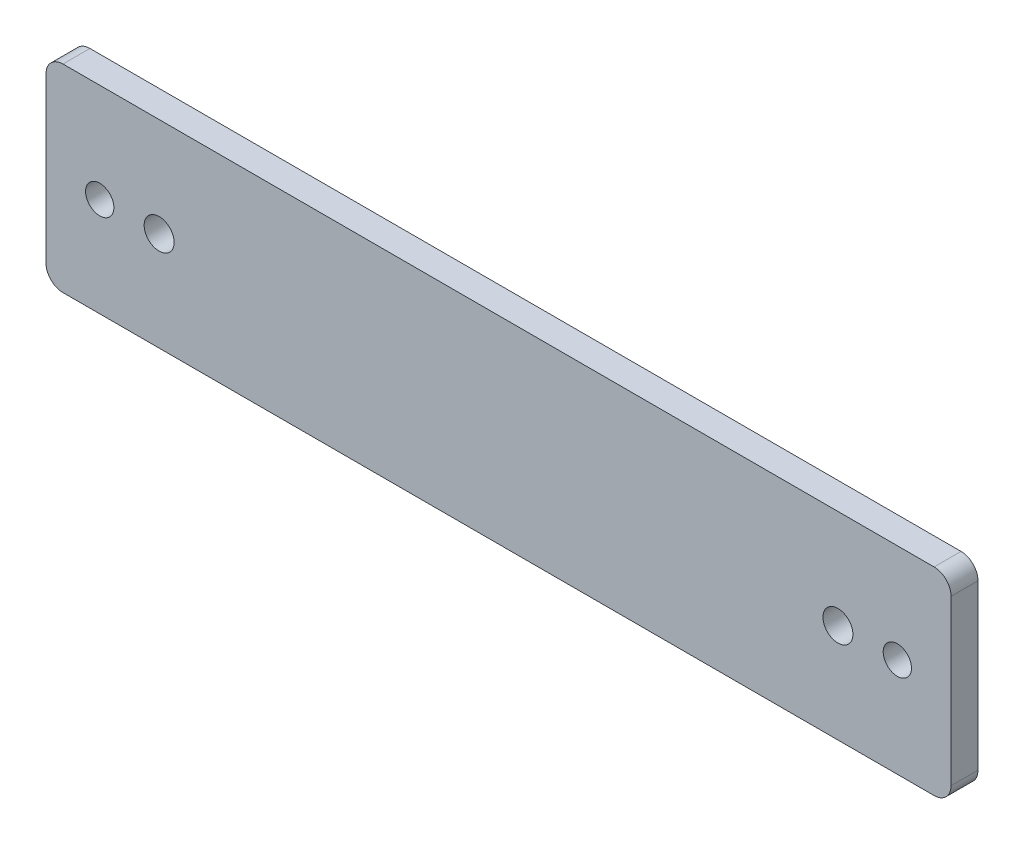
ISO-10303-21;
HEADER;
FILE_DESCRIPTION(('STEP AP214'),'2;1');
FILE_NAME('part.step','',(''),(''),'','','');
FILE_SCHEMA(('AUTOMOTIVE_DESIGN { 1 0 10303 214 1 1 1 1 }'));
ENDSEC;
DATA;
#1=APPLICATION_CONTEXT('core data for automotive mechanical design processes');
#2=APPLICATION_PROTOCOL_DEFINITION('international standard','automotive_design',2000,#1);
#3=PRODUCT_CONTEXT('',#1,'mechanical');
#4=PRODUCT('Part','Part','',(#3));
#5=PRODUCT_RELATED_PRODUCT_CATEGORY('part','',(#4));
#6=PRODUCT_DEFINITION_FORMATION('','',#4);
#7=PRODUCT_DEFINITION_CONTEXT('part definition',#1,'design');
#8=PRODUCT_DEFINITION('design','',#6,#7);
#9=PRODUCT_DEFINITION_SHAPE('','',#8);
#10=(LENGTH_UNIT() NAMED_UNIT(*) SI_UNIT(.MILLI.,.METRE.));
#11=(NAMED_UNIT(*) PLANE_ANGLE_UNIT() SI_UNIT($,.RADIAN.));
#12=(NAMED_UNIT(*) SI_UNIT($,.STERADIAN.) SOLID_ANGLE_UNIT());
#13=UNCERTAINTY_MEASURE_WITH_UNIT(LENGTH_MEASURE(1.E-05),#10,'distance_accuracy_value','');
#14=(GEOMETRIC_REPRESENTATION_CONTEXT(3) GLOBAL_UNCERTAINTY_ASSIGNED_CONTEXT((#13)) GLOBAL_UNIT_ASSIGNED_CONTEXT((#10,
#11,#12)) REPRESENTATION_CONTEXT('',''));
#15=CARTESIAN_POINT('',(0.,0.,0.));
#16=DIRECTION('',(0.,0.,1.));
#17=DIRECTION('',(1.,0.,0.));
#18=AXIS2_PLACEMENT_3D('',#15,#16,#17);
#19=CARTESIAN_POINT('',(0.,0.,4.7625));
#20=DIRECTION('',(0.,0.,-1.));
#21=DIRECTION('',(-1.,0.,0.));
#22=AXIS2_PLACEMENT_3D('',#19,#20,#21);
#23=PLANE('',#22);
#24=CARTESIAN_POINT('',(-60.,0.,4.7625));
#25=DIRECTION('',(0.,0.,1.));
#26=DIRECTION('',(1.,0.,0.));
#27=AXIS2_PLACEMENT_3D('',#24,#25,#26);
#28=CIRCLE('',#27,2.65);
#29=CARTESIAN_POINT('',(-57.35,0.,4.7625));
#30=VERTEX_POINT('',#29);
#31=EDGE_CURVE('E203',#30,#30,#28,.T.);
#32=ORIENTED_EDGE('',*,*,#31,.F.);
#33=EDGE_LOOP('',(#32));
#34=FACE_BOUND('',#33,.T.);
#35=CARTESIAN_POINT('',(60.,0.,4.7625));
#36=DIRECTION('',(0.,0.,1.));
#37=DIRECTION('',(1.,0.,0.));
#38=AXIS2_PLACEMENT_3D('',#35,#36,#37);
#39=CIRCLE('',#38,2.65);
#40=CARTESIAN_POINT('',(62.65,0.,4.7625));
#41=VERTEX_POINT('',#40);
#42=EDGE_CURVE('E197',#41,#41,#39,.T.);
#43=ORIENTED_EDGE('',*,*,#42,.F.);
#44=EDGE_LOOP('',(#43));
#45=FACE_BOUND('',#44,.T.);
#46=DIRECTION('',(1.,0.,0.));
#47=VECTOR('',#46,1.);
#48=CARTESIAN_POINT('',(-80.,-17.5,4.7625));
#49=LINE('',#48,#47);
#50=CARTESIAN_POINT('',(-77.,-17.5,4.7625));
#51=VERTEX_POINT('',#50);
#52=CARTESIAN_POINT('',(77.,-17.5,4.7625));
#53=VERTEX_POINT('',#52);
#54=EDGE_CURVE('E143',#51,#53,#49,.T.);
#55=ORIENTED_EDGE('',*,*,#54,.T.);
#56=CARTESIAN_POINT('',(77.,-14.5,4.7625));
#57=DIRECTION('',(0.,0.,-1.));
#58=DIRECTION('',(-1.,0.,0.));
#59=AXIS2_PLACEMENT_3D('',#56,#57,#58);
#60=CIRCLE('',#59,3.);
#61=CARTESIAN_POINT('',(80.,-14.5,4.7625));
#62=VERTEX_POINT('',#61);
#63=EDGE_CURVE('E161',#53,#62,#60,.F.);
#64=ORIENTED_EDGE('',*,*,#63,.T.);
#65=DIRECTION('',(0.,1.,0.));
#66=VECTOR('',#65,1.);
#67=CARTESIAN_POINT('',(80.,-17.5,4.7625));
#68=LINE('',#67,#66);
#69=CARTESIAN_POINT('',(80.,14.5,4.7625));
#70=VERTEX_POINT('',#69);
#71=EDGE_CURVE('E125',#62,#70,#68,.T.);
#72=ORIENTED_EDGE('',*,*,#71,.T.);
#73=CARTESIAN_POINT('',(77.,14.5,4.7625));
#74=DIRECTION('',(0.,0.,-1.));
#75=DIRECTION('',(-1.,0.,0.));
#76=AXIS2_PLACEMENT_3D('',#73,#74,#75);
#77=CIRCLE('',#76,3.);
#78=CARTESIAN_POINT('',(77.,17.5,4.7625));
#79=VERTEX_POINT('',#78);
#80=EDGE_CURVE('E158',#70,#79,#77,.F.);
#81=ORIENTED_EDGE('',*,*,#80,.T.);
#82=DIRECTION('',(-1.,0.,0.));
#83=VECTOR('',#82,1.);
#84=CARTESIAN_POINT('',(-80.,17.5,4.7625));
#85=LINE('',#84,#83);
#86=CARTESIAN_POINT('',(-77.,17.5,4.7625));
#87=VERTEX_POINT('',#86);
#88=EDGE_CURVE('E172',#79,#87,#85,.T.);
#89=ORIENTED_EDGE('',*,*,#88,.T.);
#90=CARTESIAN_POINT('',(-77.,14.5,4.7625));
#91=DIRECTION('',(0.,0.,-1.));
#92=DIRECTION('',(-1.,0.,0.));
#93=AXIS2_PLACEMENT_3D('',#90,#91,#92);
#94=CIRCLE('',#93,3.);
#95=CARTESIAN_POINT('',(-80.,14.5,4.7625));
#96=VERTEX_POINT('',#95);
#97=EDGE_CURVE('E61',#87,#96,#94,.F.);
#98=ORIENTED_EDGE('',*,*,#97,.T.);
#99=DIRECTION('',(0.,-1.,0.));
#100=VECTOR('',#99,1.);
#101=CARTESIAN_POINT('',(-80.,-17.5,4.7625));
#102=LINE('',#101,#100);
#103=CARTESIAN_POINT('',(-80.,-14.5,4.7625));
#104=VERTEX_POINT('',#103);
#105=EDGE_CURVE('E180',#96,#104,#102,.T.);
#106=ORIENTED_EDGE('',*,*,#105,.T.);
#107=CARTESIAN_POINT('',(-77.,-14.5,4.7625));
#108=DIRECTION('',(0.,0.,-1.));
#109=DIRECTION('',(-1.,0.,0.));
#110=AXIS2_PLACEMENT_3D('',#107,#108,#109);
#111=CIRCLE('',#110,3.);
#112=EDGE_CURVE('E156',#104,#51,#111,.F.);
#113=ORIENTED_EDGE('',*,*,#112,.T.);
#114=EDGE_LOOP('',(#55,#64,#72,#81,#89,#98,#106,#113));
#115=FACE_BOUND('',#114,.T.);
#116=CARTESIAN_POINT('',(-70.5,0.,4.7625));
#117=DIRECTION('',(0.,0.,1.));
#118=DIRECTION('',(1.,0.,0.));
#119=AXIS2_PLACEMENT_3D('',#116,#117,#118);
#120=CIRCLE('',#119,2.50000000000001);
#121=CARTESIAN_POINT('',(-73.,0.,4.7625));
#122=VERTEX_POINT('',#121);
#123=EDGE_CURVE('E134',#122,#122,#120,.T.);
#124=ORIENTED_EDGE('',*,*,#123,.F.);
#125=EDGE_LOOP('',(#124));
#126=FACE_BOUND('',#125,.T.);
#127=CARTESIAN_POINT('',(70.5,0.,4.7625));
#128=DIRECTION('',(0.,0.,1.));
#129=DIRECTION('',(1.,0.,0.));
#130=AXIS2_PLACEMENT_3D('',#127,#128,#129);
#131=CIRCLE('',#130,2.50000000000001);
#132=CARTESIAN_POINT('',(68.,0.,4.7625));
#133=VERTEX_POINT('',#132);
#134=EDGE_CURVE('E187',#133,#133,#131,.T.);
#135=ORIENTED_EDGE('',*,*,#134,.F.);
#136=EDGE_LOOP('',(#135));
#137=FACE_BOUND('',#136,.T.);
#138=ADVANCED_FACE('F39',(#34,#45,#115,#126,#137),#23,.F.);
#139=CARTESIAN_POINT('',(0.,0.,0.));
#140=DIRECTION('',(0.,0.,-1.));
#141=DIRECTION('',(-1.,0.,0.));
#142=AXIS2_PLACEMENT_3D('',#139,#140,#141);
#143=PLANE('',#142);
#144=CARTESIAN_POINT('',(-60.,0.,0.));
#145=DIRECTION('',(0.,0.,1.));
#146=DIRECTION('',(1.,0.,0.));
#147=AXIS2_PLACEMENT_3D('',#144,#145,#146);
#148=CIRCLE('',#147,2.65);
#149=CARTESIAN_POINT('',(-57.35,0.,0.));
#150=VERTEX_POINT('',#149);
#151=EDGE_CURVE('E200',#150,#150,#148,.T.);
#152=ORIENTED_EDGE('',*,*,#151,.T.);
#153=EDGE_LOOP('',(#152));
#154=FACE_BOUND('',#153,.T.);
#155=CARTESIAN_POINT('',(60.,0.,0.));
#156=DIRECTION('',(0.,0.,1.));
#157=DIRECTION('',(1.,0.,0.));
#158=AXIS2_PLACEMENT_3D('',#155,#156,#157);
#159=CIRCLE('',#158,2.65);
#160=CARTESIAN_POINT('',(62.65,0.,0.));
#161=VERTEX_POINT('',#160);
#162=EDGE_CURVE('E192',#161,#161,#159,.T.);
#163=ORIENTED_EDGE('',*,*,#162,.T.);
#164=EDGE_LOOP('',(#163));
#165=FACE_BOUND('',#164,.T.);
#166=CARTESIAN_POINT('',(-70.5,0.,0.));
#167=DIRECTION('',(0.,0.,1.));
#168=DIRECTION('',(1.,0.,0.));
#169=AXIS2_PLACEMENT_3D('',#166,#167,#168);
#170=CIRCLE('',#169,2.50000000000001);
#171=CARTESIAN_POINT('',(-73.,0.,0.));
#172=VERTEX_POINT('',#171);
#173=EDGE_CURVE('E140',#172,#172,#170,.T.);
#174=ORIENTED_EDGE('',*,*,#173,.T.);
#175=EDGE_LOOP('',(#174));
#176=FACE_BOUND('',#175,.T.);
#177=DIRECTION('',(0.,1.,0.));
#178=VECTOR('',#177,1.);
#179=CARTESIAN_POINT('',(80.,-17.5,0.));
#180=LINE('',#179,#178);
#181=CARTESIAN_POINT('',(80.,-14.5,0.));
#182=VERTEX_POINT('',#181);
#183=CARTESIAN_POINT('',(80.,14.5,0.));
#184=VERTEX_POINT('',#183);
#185=EDGE_CURVE('E122',#182,#184,#180,.T.);
#186=ORIENTED_EDGE('',*,*,#185,.F.);
#187=CARTESIAN_POINT('',(77.,-14.5,0.));
#188=DIRECTION('',(0.,0.,-1.));
#189=DIRECTION('',(-1.,0.,0.));
#190=AXIS2_PLACEMENT_3D('',#187,#188,#189);
#191=CIRCLE('',#190,3.);
#192=CARTESIAN_POINT('',(77.,-17.5,0.));
#193=VERTEX_POINT('',#192);
#194=EDGE_CURVE('E105',#182,#193,#191,.T.);
#195=ORIENTED_EDGE('',*,*,#194,.T.);
#196=DIRECTION('',(1.,0.,0.));
#197=VECTOR('',#196,1.);
#198=CARTESIAN_POINT('',(-80.,-17.5,0.));
#199=LINE('',#198,#197);
#200=CARTESIAN_POINT('',(-77.,-17.5,0.));
#201=VERTEX_POINT('',#200);
#202=EDGE_CURVE('E147',#201,#193,#199,.T.);
#203=ORIENTED_EDGE('',*,*,#202,.F.);
#204=CARTESIAN_POINT('',(-77.,-14.5,0.));
#205=DIRECTION('',(0.,0.,-1.));
#206=DIRECTION('',(-1.,0.,0.));
#207=AXIS2_PLACEMENT_3D('',#204,#205,#206);
#208=CIRCLE('',#207,3.);
#209=CARTESIAN_POINT('',(-80.,-14.5,0.));
#210=VERTEX_POINT('',#209);
#211=EDGE_CURVE('E126',#201,#210,#208,.T.);
#212=ORIENTED_EDGE('',*,*,#211,.T.);
#213=DIRECTION('',(0.,-1.,0.));
#214=VECTOR('',#213,1.);
#215=CARTESIAN_POINT('',(-80.,-17.5,0.));
#216=LINE('',#215,#214);
#217=CARTESIAN_POINT('',(-80.,14.5,0.));
#218=VERTEX_POINT('',#217);
#219=EDGE_CURVE('E137',#218,#210,#216,.T.);
#220=ORIENTED_EDGE('',*,*,#219,.F.);
#221=CARTESIAN_POINT('',(-77.,14.5,0.));
#222=DIRECTION('',(0.,0.,-1.));
#223=DIRECTION('',(-1.,0.,0.));
#224=AXIS2_PLACEMENT_3D('',#221,#222,#223);
#225=CIRCLE('',#224,3.);
#226=CARTESIAN_POINT('',(-77.,17.5,0.));
#227=VERTEX_POINT('',#226);
#228=EDGE_CURVE('E116',#218,#227,#225,.T.);
#229=ORIENTED_EDGE('',*,*,#228,.T.);
#230=DIRECTION('',(-1.,0.,0.));
#231=VECTOR('',#230,1.);
#232=CARTESIAN_POINT('',(-80.,17.5,0.));
#233=LINE('',#232,#231);
#234=CARTESIAN_POINT('',(77.,17.5,0.));
#235=VERTEX_POINT('',#234);
#236=EDGE_CURVE('E133',#235,#227,#233,.T.);
#237=ORIENTED_EDGE('',*,*,#236,.F.);
#238=CARTESIAN_POINT('',(77.,14.5,0.));
#239=DIRECTION('',(0.,0.,-1.));
#240=DIRECTION('',(-1.,0.,0.));
#241=AXIS2_PLACEMENT_3D('',#238,#239,#240);
#242=CIRCLE('',#241,3.);
#243=EDGE_CURVE('E132',#235,#184,#242,.T.);
#244=ORIENTED_EDGE('',*,*,#243,.T.);
#245=EDGE_LOOP('',(#186,#195,#203,#212,#220,#229,#237,#244));
#246=FACE_BOUND('',#245,.T.);
#247=CARTESIAN_POINT('',(70.5,0.,0.));
#248=DIRECTION('',(0.,0.,1.));
#249=DIRECTION('',(1.,0.,0.));
#250=AXIS2_PLACEMENT_3D('',#247,#248,#249);
#251=CIRCLE('',#250,2.50000000000001);
#252=CARTESIAN_POINT('',(68.,0.,0.));
#253=VERTEX_POINT('',#252);
#254=EDGE_CURVE('E189',#253,#253,#251,.T.);
#255=ORIENTED_EDGE('',*,*,#254,.T.);
#256=EDGE_LOOP('',(#255));
#257=FACE_BOUND('',#256,.T.);
#258=ADVANCED_FACE('F129',(#154,#165,#176,#246,#257),#143,.T.);
#259=CARTESIAN_POINT('',(80.,-17.5,4.7625));
#260=DIRECTION('',(-1.,0.,0.));
#261=DIRECTION('',(0.,0.,1.));
#262=AXIS2_PLACEMENT_3D('',#259,#260,#261);
#263=PLANE('',#262);
#264=ORIENTED_EDGE('',*,*,#71,.F.);
#265=DIRECTION('',(0.,0.,-1.));
#266=VECTOR('',#265,1.);
#267=CARTESIAN_POINT('',(80.,-14.5,4.7625));
#268=LINE('',#267,#266);
#269=EDGE_CURVE('E109',#62,#182,#268,.T.);
#270=ORIENTED_EDGE('',*,*,#269,.T.);
#271=ORIENTED_EDGE('',*,*,#185,.T.);
#272=DIRECTION('',(0.,0.,-1.));
#273=VECTOR('',#272,1.);
#274=CARTESIAN_POINT('',(80.,14.5,4.7625));
#275=LINE('',#274,#273);
#276=EDGE_CURVE('E127',#184,#70,#275,.F.);
#277=ORIENTED_EDGE('',*,*,#276,.T.);
#278=EDGE_LOOP('',(#264,#270,#271,#277));
#279=FACE_BOUND('',#278,.T.);
#280=ADVANCED_FACE('F121',(#279),#263,.F.);
#281=CARTESIAN_POINT('',(-80.,17.5,4.7625));
#282=DIRECTION('',(0.,-1.,0.));
#283=DIRECTION('',(0.,0.,-1.));
#284=AXIS2_PLACEMENT_3D('',#281,#282,#283);
#285=PLANE('',#284);
#286=ORIENTED_EDGE('',*,*,#236,.T.);
#287=DIRECTION('',(0.,0.,-1.));
#288=VECTOR('',#287,1.);
#289=CARTESIAN_POINT('',(-77.,17.5,4.7625));
#290=LINE('',#289,#288);
#291=EDGE_CURVE('E11',#227,#87,#290,.F.);
#292=ORIENTED_EDGE('',*,*,#291,.T.);
#293=ORIENTED_EDGE('',*,*,#88,.F.);
#294=DIRECTION('',(0.,0.,-1.));
#295=VECTOR('',#294,1.);
#296=CARTESIAN_POINT('',(77.,17.5,4.7625));
#297=LINE('',#296,#295);
#298=EDGE_CURVE('E47',#79,#235,#297,.T.);
#299=ORIENTED_EDGE('',*,*,#298,.T.);
#300=EDGE_LOOP('',(#286,#292,#293,#299));
#301=FACE_BOUND('',#300,.T.);
#302=ADVANCED_FACE('F170',(#301),#285,.F.);
#303=CARTESIAN_POINT('',(-80.,-17.5,4.7625));
#304=DIRECTION('',(1.,0.,0.));
#305=DIRECTION('',(0.,0.,-1.));
#306=AXIS2_PLACEMENT_3D('',#303,#304,#305);
#307=PLANE('',#306);
#308=ORIENTED_EDGE('',*,*,#105,.F.);
#309=DIRECTION('',(0.,0.,-1.));
#310=VECTOR('',#309,1.);
#311=CARTESIAN_POINT('',(-80.,14.5,4.7625));
#312=LINE('',#311,#310);
#313=EDGE_CURVE('E164',#96,#218,#312,.T.);
#314=ORIENTED_EDGE('',*,*,#313,.T.);
#315=ORIENTED_EDGE('',*,*,#219,.T.);
#316=DIRECTION('',(0.,0.,-1.));
#317=VECTOR('',#316,1.);
#318=CARTESIAN_POINT('',(-80.,-14.5,4.7625));
#319=LINE('',#318,#317);
#320=EDGE_CURVE('E54',#210,#104,#319,.F.);
#321=ORIENTED_EDGE('',*,*,#320,.T.);
#322=EDGE_LOOP('',(#308,#314,#315,#321));
#323=FACE_BOUND('',#322,.T.);
#324=ADVANCED_FACE('F179',(#323),#307,.F.);
#325=CARTESIAN_POINT('',(-80.,-17.5,4.7625));
#326=DIRECTION('',(0.,1.,0.));
#327=DIRECTION('',(0.,0.,1.));
#328=AXIS2_PLACEMENT_3D('',#325,#326,#327);
#329=PLANE('',#328);
#330=ORIENTED_EDGE('',*,*,#202,.T.);
#331=DIRECTION('',(0.,0.,-1.));
#332=VECTOR('',#331,1.);
#333=CARTESIAN_POINT('',(77.,-17.5,4.7625));
#334=LINE('',#333,#332);
#335=EDGE_CURVE('E110',#193,#53,#334,.F.);
#336=ORIENTED_EDGE('',*,*,#335,.T.);
#337=ORIENTED_EDGE('',*,*,#54,.F.);
#338=DIRECTION('',(0.,0.,-1.));
#339=VECTOR('',#338,1.);
#340=CARTESIAN_POINT('',(-77.,-17.5,4.7625));
#341=LINE('',#340,#339);
#342=EDGE_CURVE('E115',#51,#201,#341,.T.);
#343=ORIENTED_EDGE('',*,*,#342,.T.);
#344=EDGE_LOOP('',(#330,#336,#337,#343));
#345=FACE_BOUND('',#344,.T.);
#346=ADVANCED_FACE('F236',(#345),#329,.F.);
#347=CARTESIAN_POINT('',(-70.5,0.,4.7625));
#348=DIRECTION('',(0.,0.,-1.));
#349=DIRECTION('',(-1.,0.,0.));
#350=AXIS2_PLACEMENT_3D('',#347,#348,#349);
#351=CYLINDRICAL_SURFACE('',#350,2.50000000000001);
#352=CARTESIAN_POINT('',(-73.,0.,4.7625));
#353=CARTESIAN_POINT('',(-73.,0.,4.712890625));
#354=CARTESIAN_POINT('',(-73.,0.,4.66328125));
#355=CARTESIAN_POINT('',(-73.,0.,4.5640625));
#356=CARTESIAN_POINT('',(-73.,0.,4.514453125));
#357=CARTESIAN_POINT('',(-73.,0.,4.415234375));
#358=CARTESIAN_POINT('',(-73.,0.,4.365625));
#359=CARTESIAN_POINT('',(-73.,0.,4.26640625));
#360=CARTESIAN_POINT('',(-73.,0.,4.216796875));
#361=CARTESIAN_POINT('',(-73.,0.,4.117578125));
#362=CARTESIAN_POINT('',(-73.,0.,4.06796875));
#363=CARTESIAN_POINT('',(-73.,0.,3.96875));
#364=CARTESIAN_POINT('',(-73.,0.,3.919140625));
#365=CARTESIAN_POINT('',(-73.,0.,3.819921875));
#366=CARTESIAN_POINT('',(-73.,0.,3.7703125));
#367=CARTESIAN_POINT('',(-73.,0.,3.67109375));
#368=CARTESIAN_POINT('',(-73.,0.,3.621484375));
#369=CARTESIAN_POINT('',(-73.,0.,3.522265625));
#370=CARTESIAN_POINT('',(-73.,0.,3.47265625));
#371=CARTESIAN_POINT('',(-73.,0.,3.3734375));
#372=CARTESIAN_POINT('',(-73.,0.,3.323828125));
#373=CARTESIAN_POINT('',(-73.,0.,3.224609375));
#374=CARTESIAN_POINT('',(-73.,0.,3.175));
#375=CARTESIAN_POINT('',(-73.,0.,3.07578125));
#376=CARTESIAN_POINT('',(-73.,0.,3.026171875));
#377=CARTESIAN_POINT('',(-73.,0.,2.926953125));
#378=CARTESIAN_POINT('',(-73.,0.,2.87734375));
#379=CARTESIAN_POINT('',(-73.,0.,2.778125));
#380=CARTESIAN_POINT('',(-73.,0.,2.728515625));
#381=CARTESIAN_POINT('',(-73.,0.,2.629296875));
#382=CARTESIAN_POINT('',(-73.,0.,2.5796875));
#383=CARTESIAN_POINT('',(-73.,0.,2.48046875));
#384=CARTESIAN_POINT('',(-73.,0.,2.430859375));
#385=CARTESIAN_POINT('',(-73.,0.,2.331640625));
#386=CARTESIAN_POINT('',(-73.,0.,2.28203125));
#387=CARTESIAN_POINT('',(-73.,0.,2.1828125));
#388=CARTESIAN_POINT('',(-73.,0.,2.133203125));
#389=CARTESIAN_POINT('',(-73.,0.,2.033984375));
#390=CARTESIAN_POINT('',(-73.,0.,1.984375));
#391=CARTESIAN_POINT('',(-73.,0.,1.88515625));
#392=CARTESIAN_POINT('',(-73.,0.,1.835546875));
#393=CARTESIAN_POINT('',(-73.,0.,1.736328125));
#394=CARTESIAN_POINT('',(-73.,0.,1.68671875));
#395=CARTESIAN_POINT('',(-73.,0.,1.5875));
#396=CARTESIAN_POINT('',(-73.,0.,1.537890625));
#397=CARTESIAN_POINT('',(-73.,0.,1.438671875));
#398=CARTESIAN_POINT('',(-73.,0.,1.3890625));
#399=CARTESIAN_POINT('',(-73.,0.,1.28984375));
#400=CARTESIAN_POINT('',(-73.,0.,1.240234375));
#401=CARTESIAN_POINT('',(-73.,0.,1.141015625));
#402=CARTESIAN_POINT('',(-73.,0.,1.09140625));
#403=CARTESIAN_POINT('',(-73.,0.,0.992187499999999));
#404=CARTESIAN_POINT('',(-73.,0.,0.942578124999999));
#405=CARTESIAN_POINT('',(-73.,0.,0.843359375));
#406=CARTESIAN_POINT('',(-73.,0.,0.79375));
#407=CARTESIAN_POINT('',(-73.,0.,0.69453125));
#408=CARTESIAN_POINT('',(-73.,0.,0.644921875));
#409=CARTESIAN_POINT('',(-73.,0.,0.545703125));
#410=CARTESIAN_POINT('',(-73.,0.,0.49609375));
#411=CARTESIAN_POINT('',(-73.,0.,0.396875));
#412=CARTESIAN_POINT('',(-73.,0.,0.347265625));
#413=CARTESIAN_POINT('',(-73.,0.,0.248046875));
#414=CARTESIAN_POINT('',(-73.,0.,0.1984375));
#415=CARTESIAN_POINT('',(-73.,0.,0.09921875));
#416=CARTESIAN_POINT('',(-73.,0.,0.049609375));
#417=CARTESIAN_POINT('',(-73.,0.,0.));
#418=B_SPLINE_CURVE_WITH_KNOTS('',3,(#352,#353,#354,#355,#356,#357,#358,#359,#360,#361,#362,
#363,#364,#365,#366,#367,#368,#369,#370,#371,#372,#373,#374,#375,#376,#377,#378,#379,#380,#381,
#382,#383,#384,#385,#386,#387,#388,#389,#390,#391,#392,#393,#394,#395,#396,#397,#398,#399,#400,
#401,#402,#403,#404,#405,#406,#407,#408,#409,#410,#411,#412,#413,#414,#415,#416,#417),
.UNSPECIFIED.,.F.,.F.,(4,2,2,2,2,2,2,2,2,2,2,2,2,2,2,2,2,2,2,2,2,2,2,2,2,2,2,2,2,2,2,2,4),(0.,
0.148828125,0.29765625,0.446484375,0.5953125,0.744140625,0.892968750000001,1.041796875,1.190625,
1.339453125,1.48828125,1.637109375,1.7859375,1.934765625,2.08359375,2.232421875,2.38125,
2.530078125,2.67890625,2.827734375,2.9765625,3.125390625,3.27421875,3.423046875,3.571875,
3.720703125,3.86953125,4.018359375,4.1671875,4.316015625,4.46484375,4.613671875,4.7625),.UNSPECIFIED.);
#419=EDGE_CURVE('BSEAM223',#122,#172,#418,.T.);
#420=ORIENTED_EDGE('',*,*,#123,.T.);
#421=ORIENTED_EDGE('',*,*,#173,.F.);
#422=ORIENTED_EDGE('',*,*,#419,.T.);
#423=ORIENTED_EDGE('',*,*,#419,.F.);
#424=EDGE_LOOP('',(#420,#422,#421,#423));
#425=FACE_BOUND('',#424,.T.);
#426=ADVANCED_FACE('F223',(#425),#351,.F.);
#427=CARTESIAN_POINT('',(70.5,0.,4.7625));
#428=DIRECTION('',(0.,0.,-1.));
#429=DIRECTION('',(-1.,0.,0.));
#430=AXIS2_PLACEMENT_3D('',#427,#428,#429);
#431=CYLINDRICAL_SURFACE('',#430,2.50000000000001);
#432=CARTESIAN_POINT('',(68.,0.,4.7625));
#433=CARTESIAN_POINT('',(68.,0.,4.712890625));
#434=CARTESIAN_POINT('',(68.,0.,4.66328125));
#435=CARTESIAN_POINT('',(68.,0.,4.5640625));
#436=CARTESIAN_POINT('',(68.,0.,4.514453125));
#437=CARTESIAN_POINT('',(68.,0.,4.415234375));
#438=CARTESIAN_POINT('',(68.,0.,4.365625));
#439=CARTESIAN_POINT('',(68.,0.,4.26640625));
#440=CARTESIAN_POINT('',(68.,0.,4.216796875));
#441=CARTESIAN_POINT('',(68.,0.,4.117578125));
#442=CARTESIAN_POINT('',(68.,0.,4.06796875));
#443=CARTESIAN_POINT('',(68.,0.,3.96875));
#444=CARTESIAN_POINT('',(68.,0.,3.919140625));
#445=CARTESIAN_POINT('',(68.,0.,3.819921875));
#446=CARTESIAN_POINT('',(68.,0.,3.7703125));
#447=CARTESIAN_POINT('',(68.,0.,3.67109375));
#448=CARTESIAN_POINT('',(68.,0.,3.621484375));
#449=CARTESIAN_POINT('',(68.,0.,3.522265625));
#450=CARTESIAN_POINT('',(68.,0.,3.47265625));
#451=CARTESIAN_POINT('',(68.,0.,3.3734375));
#452=CARTESIAN_POINT('',(68.,0.,3.323828125));
#453=CARTESIAN_POINT('',(68.,0.,3.224609375));
#454=CARTESIAN_POINT('',(68.,0.,3.175));
#455=CARTESIAN_POINT('',(68.,0.,3.07578125));
#456=CARTESIAN_POINT('',(68.,0.,3.026171875));
#457=CARTESIAN_POINT('',(68.,0.,2.926953125));
#458=CARTESIAN_POINT('',(68.,0.,2.87734375));
#459=CARTESIAN_POINT('',(68.,0.,2.778125));
#460=CARTESIAN_POINT('',(68.,0.,2.728515625));
#461=CARTESIAN_POINT('',(68.,0.,2.629296875));
#462=CARTESIAN_POINT('',(68.,0.,2.5796875));
#463=CARTESIAN_POINT('',(68.,0.,2.48046875));
#464=CARTESIAN_POINT('',(68.,0.,2.430859375));
#465=CARTESIAN_POINT('',(68.,0.,2.331640625));
#466=CARTESIAN_POINT('',(68.,0.,2.28203125));
#467=CARTESIAN_POINT('',(68.,0.,2.1828125));
#468=CARTESIAN_POINT('',(68.,0.,2.133203125));
#469=CARTESIAN_POINT('',(68.,0.,2.033984375));
#470=CARTESIAN_POINT('',(68.,0.,1.984375));
#471=CARTESIAN_POINT('',(68.,0.,1.88515625));
#472=CARTESIAN_POINT('',(68.,0.,1.835546875));
#473=CARTESIAN_POINT('',(68.,0.,1.736328125));
#474=CARTESIAN_POINT('',(68.,0.,1.68671875));
#475=CARTESIAN_POINT('',(68.,0.,1.5875));
#476=CARTESIAN_POINT('',(68.,0.,1.537890625));
#477=CARTESIAN_POINT('',(68.,0.,1.438671875));
#478=CARTESIAN_POINT('',(68.,0.,1.3890625));
#479=CARTESIAN_POINT('',(68.,0.,1.28984375));
#480=CARTESIAN_POINT('',(68.,0.,1.240234375));
#481=CARTESIAN_POINT('',(68.,0.,1.141015625));
#482=CARTESIAN_POINT('',(68.,0.,1.09140625));
#483=CARTESIAN_POINT('',(68.,0.,0.992187499999999));
#484=CARTESIAN_POINT('',(68.,0.,0.942578124999999));
#485=CARTESIAN_POINT('',(68.,0.,0.843359375));
#486=CARTESIAN_POINT('',(68.,0.,0.79375));
#487=CARTESIAN_POINT('',(68.,0.,0.69453125));
#488=CARTESIAN_POINT('',(68.,0.,0.644921875));
#489=CARTESIAN_POINT('',(68.,0.,0.545703125));
#490=CARTESIAN_POINT('',(68.,0.,0.49609375));
#491=CARTESIAN_POINT('',(68.,0.,0.396875));
#492=CARTESIAN_POINT('',(68.,0.,0.347265625));
#493=CARTESIAN_POINT('',(68.,0.,0.248046875));
#494=CARTESIAN_POINT('',(68.,0.,0.1984375));
#495=CARTESIAN_POINT('',(68.,0.,0.09921875));
#496=CARTESIAN_POINT('',(68.,0.,0.049609375));
#497=CARTESIAN_POINT('',(68.,0.,0.));
#498=B_SPLINE_CURVE_WITH_KNOTS('',3,(#432,#433,#434,#435,#436,#437,#438,#439,#440,#441,#442,
#443,#444,#445,#446,#447,#448,#449,#450,#451,#452,#453,#454,#455,#456,#457,#458,#459,#460,#461,
#462,#463,#464,#465,#466,#467,#468,#469,#470,#471,#472,#473,#474,#475,#476,#477,#478,#479,#480,
#481,#482,#483,#484,#485,#486,#487,#488,#489,#490,#491,#492,#493,#494,#495,#496,#497),
.UNSPECIFIED.,.F.,.F.,(4,2,2,2,2,2,2,2,2,2,2,2,2,2,2,2,2,2,2,2,2,2,2,2,2,2,2,2,2,2,2,2,4),(0.,
0.148828125,0.29765625,0.446484375,0.5953125,0.744140625,0.892968750000001,1.041796875,1.190625,
1.339453125,1.48828125,1.637109375,1.7859375,1.934765625,2.08359375,2.232421875,2.38125,
2.530078125,2.67890625,2.827734375,2.9765625,3.125390625,3.27421875,3.423046875,3.571875,
3.720703125,3.86953125,4.018359375,4.1671875,4.316015625,4.46484375,4.613671875,4.7625),.UNSPECIFIED.);
#499=EDGE_CURVE('BSEAM219',#133,#253,#498,.T.);
#500=ORIENTED_EDGE('',*,*,#134,.T.);
#501=ORIENTED_EDGE('',*,*,#254,.F.);
#502=ORIENTED_EDGE('',*,*,#499,.T.);
#503=ORIENTED_EDGE('',*,*,#499,.F.);
#504=EDGE_LOOP('',(#500,#502,#501,#503));
#505=FACE_BOUND('',#504,.T.);
#506=ADVANCED_FACE('F219',(#505),#431,.F.);
#507=CARTESIAN_POINT('',(60.,0.,4.7625));
#508=DIRECTION('',(0.,0.,1.));
#509=DIRECTION('',(1.,0.,0.));
#510=AXIS2_PLACEMENT_3D('',#507,#508,#509);
#511=CYLINDRICAL_SURFACE('',#510,2.65);
#512=ORIENTED_EDGE('',*,*,#162,.F.);
#513=EDGE_LOOP('',(#512));
#514=FACE_BOUND('',#513,.T.);
#515=ORIENTED_EDGE('',*,*,#42,.T.);
#516=EDGE_LOOP('',(#515));
#517=FACE_BOUND('',#516,.T.);
#518=ADVANCED_FACE('F222',(#514,#517),#511,.F.);
#519=CARTESIAN_POINT('',(-60.,0.,4.7625));
#520=DIRECTION('',(0.,0.,1.));
#521=DIRECTION('',(1.,0.,0.));
#522=AXIS2_PLACEMENT_3D('',#519,#520,#521);
#523=CYLINDRICAL_SURFACE('',#522,2.65);
#524=ORIENTED_EDGE('',*,*,#151,.F.);
#525=EDGE_LOOP('',(#524));
#526=FACE_BOUND('',#525,.T.);
#527=ORIENTED_EDGE('',*,*,#31,.T.);
#528=EDGE_LOOP('',(#527));
#529=FACE_BOUND('',#528,.T.);
#530=ADVANCED_FACE('F207',(#526,#529),#523,.F.);
#531=CARTESIAN_POINT('',(77.,-14.5,4.7625));
#532=DIRECTION('',(0.,0.,-1.));
#533=DIRECTION('',(-1.,0.,0.));
#534=AXIS2_PLACEMENT_3D('',#531,#532,#533);
#535=CYLINDRICAL_SURFACE('',#534,3.);
#536=ORIENTED_EDGE('',*,*,#63,.F.);
#537=ORIENTED_EDGE('',*,*,#335,.F.);
#538=ORIENTED_EDGE('',*,*,#194,.F.);
#539=ORIENTED_EDGE('',*,*,#269,.F.);
#540=EDGE_LOOP('',(#536,#537,#538,#539));
#541=FACE_BOUND('',#540,.T.);
#542=ADVANCED_FACE('F108',(#541),#535,.T.);
#543=CARTESIAN_POINT('',(-77.,14.5,4.7625));
#544=DIRECTION('',(0.,0.,-1.));
#545=DIRECTION('',(-1.,0.,0.));
#546=AXIS2_PLACEMENT_3D('',#543,#544,#545);
#547=CYLINDRICAL_SURFACE('',#546,3.);
#548=ORIENTED_EDGE('',*,*,#97,.F.);
#549=ORIENTED_EDGE('',*,*,#291,.F.);
#550=ORIENTED_EDGE('',*,*,#228,.F.);
#551=ORIENTED_EDGE('',*,*,#313,.F.);
#552=EDGE_LOOP('',(#548,#549,#550,#551));
#553=FACE_BOUND('',#552,.T.);
#554=ADVANCED_FACE('F178',(#553),#547,.T.);
#555=CARTESIAN_POINT('',(77.,14.5,4.7625));
#556=DIRECTION('',(0.,0.,-1.));
#557=DIRECTION('',(-1.,0.,0.));
#558=AXIS2_PLACEMENT_3D('',#555,#556,#557);
#559=CYLINDRICAL_SURFACE('',#558,3.);
#560=ORIENTED_EDGE('',*,*,#80,.F.);
#561=ORIENTED_EDGE('',*,*,#276,.F.);
#562=ORIENTED_EDGE('',*,*,#243,.F.);
#563=ORIENTED_EDGE('',*,*,#298,.F.);
#564=EDGE_LOOP('',(#560,#561,#562,#563));
#565=FACE_BOUND('',#564,.T.);
#566=ADVANCED_FACE('F247',(#565),#559,.T.);
#567=CARTESIAN_POINT('',(-77.,-14.5,4.7625));
#568=DIRECTION('',(0.,0.,-1.));
#569=DIRECTION('',(-1.,0.,0.));
#570=AXIS2_PLACEMENT_3D('',#567,#568,#569);
#571=CYLINDRICAL_SURFACE('',#570,3.);
#572=ORIENTED_EDGE('',*,*,#112,.F.);
#573=ORIENTED_EDGE('',*,*,#320,.F.);
#574=ORIENTED_EDGE('',*,*,#211,.F.);
#575=ORIENTED_EDGE('',*,*,#342,.F.);
#576=EDGE_LOOP('',(#572,#573,#574,#575));
#577=FACE_BOUND('',#576,.T.);
#578=ADVANCED_FACE('F41',(#577),#571,.T.);
#579=CLOSED_SHELL('',(#138,#258,#280,#302,#324,#346,#426,#506,#518,#530,#542,#554,#566,#578));
#580=MANIFOLD_SOLID_BREP('B2',#579);
#581=ADVANCED_BREP_SHAPE_REPRESENTATION('',(#18,#580),#14);
#582=SHAPE_DEFINITION_REPRESENTATION(#9,#581);
ENDSEC;
END-ISO-10303-21;
